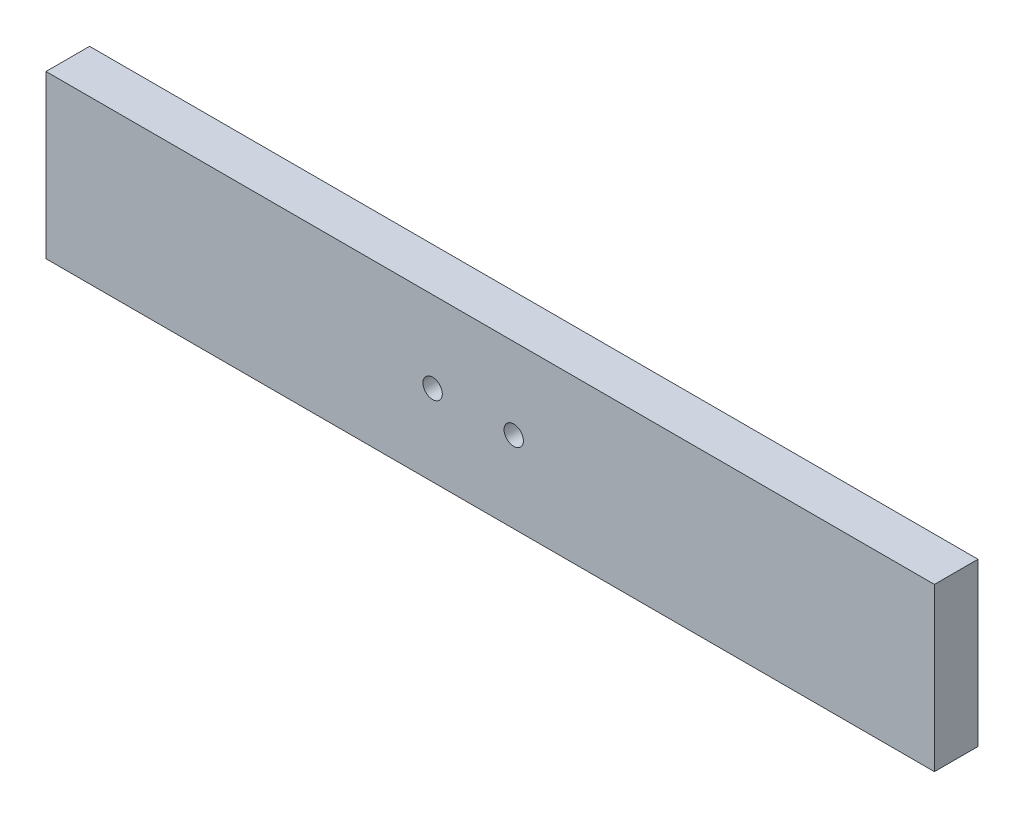
ISO-10303-21;
HEADER;
FILE_DESCRIPTION(('STEP AP214'),'2;1');
FILE_NAME('part.step','',(''),(''),'','','');
FILE_SCHEMA(('AUTOMOTIVE_DESIGN { 1 0 10303 214 1 1 1 1 }'));
ENDSEC;
DATA;
#1=APPLICATION_CONTEXT('core data for automotive mechanical design processes');
#2=APPLICATION_PROTOCOL_DEFINITION('international standard','automotive_design',2000,#1);
#3=PRODUCT_CONTEXT('',#1,'mechanical');
#4=PRODUCT('Part','Part','',(#3));
#5=PRODUCT_RELATED_PRODUCT_CATEGORY('part','',(#4));
#6=PRODUCT_DEFINITION_FORMATION('','',#4);
#7=PRODUCT_DEFINITION_CONTEXT('part definition',#1,'design');
#8=PRODUCT_DEFINITION('design','',#6,#7);
#9=PRODUCT_DEFINITION_SHAPE('','',#8);
#10=(LENGTH_UNIT() NAMED_UNIT(*) SI_UNIT(.MILLI.,.METRE.));
#11=(NAMED_UNIT(*) PLANE_ANGLE_UNIT() SI_UNIT($,.RADIAN.));
#12=(NAMED_UNIT(*) SI_UNIT($,.STERADIAN.) SOLID_ANGLE_UNIT());
#13=UNCERTAINTY_MEASURE_WITH_UNIT(LENGTH_MEASURE(1.E-05),#10,'distance_accuracy_value','');
#14=(GEOMETRIC_REPRESENTATION_CONTEXT(3) GLOBAL_UNCERTAINTY_ASSIGNED_CONTEXT((#13)) GLOBAL_UNIT_ASSIGNED_CONTEXT((#10,
#11,#12)) REPRESENTATION_CONTEXT('',''));
#15=CARTESIAN_POINT('',(0.,0.,0.));
#16=DIRECTION('',(0.,0.,1.));
#17=DIRECTION('',(1.,0.,0.));
#18=AXIS2_PLACEMENT_3D('',#15,#16,#17);
#19=CARTESIAN_POINT('',(0.,0.,18.));
#20=DIRECTION('',(0.,0.,1.));
#21=DIRECTION('',(1.,0.,0.));
#22=AXIS2_PLACEMENT_3D('',#19,#20,#21);
#23=PLANE('',#22);
#24=CARTESIAN_POINT('',(-174.551197831019,-31.3827880688748,18.));
#25=DIRECTION('',(0.,0.,1.));
#26=DIRECTION('',(1.,0.,0.));
#27=AXIS2_PLACEMENT_3D('',#24,#25,#26);
#28=CIRCLE('',#27,3.99999999999999);
#29=CARTESIAN_POINT('',(-170.551197831019,-31.3827880688748,18.));
#30=VERTEX_POINT('',#29);
#31=EDGE_CURVE('E100',#30,#30,#28,.T.);
#32=ORIENTED_EDGE('',*,*,#31,.F.);
#33=EDGE_LOOP('',(#32));
#34=FACE_BOUND('',#33,.T.);
#35=DIRECTION('',(0.,-1.,0.));
#36=VECTOR('',#35,1.);
#37=CARTESIAN_POINT('',(-334.261625266486,2.11721193112521,18.));
#38=LINE('',#37,#36);
#39=CARTESIAN_POINT('',(-334.261625266486,2.11721193112521,18.));
#40=VERTEX_POINT('',#39);
#41=CARTESIAN_POINT('',(-334.261625266486,-64.8827880688748,18.));
#42=VERTEX_POINT('',#41);
#43=EDGE_CURVE('E85',#40,#42,#38,.T.);
#44=ORIENTED_EDGE('',*,*,#43,.T.);
#45=DIRECTION('',(1.,0.,0.));
#46=VECTOR('',#45,1.);
#47=CARTESIAN_POINT('',(-334.261625266486,-64.8827880688748,18.));
#48=LINE('',#47,#46);
#49=CARTESIAN_POINT('',(32.7383747335144,-64.8827880688748,18.));
#50=VERTEX_POINT('',#49);
#51=EDGE_CURVE('E80',#42,#50,#48,.T.);
#52=ORIENTED_EDGE('',*,*,#51,.T.);
#53=DIRECTION('',(0.,1.,0.));
#54=VECTOR('',#53,1.);
#55=CARTESIAN_POINT('',(32.7383747335144,2.11721193112521,18.));
#56=LINE('',#55,#54);
#57=CARTESIAN_POINT('',(32.7383747335144,2.11721193112521,18.));
#58=VERTEX_POINT('',#57);
#59=EDGE_CURVE('E83',#50,#58,#56,.T.);
#60=ORIENTED_EDGE('',*,*,#59,.T.);
#61=DIRECTION('',(-1.,0.,0.));
#62=VECTOR('',#61,1.);
#63=CARTESIAN_POINT('',(-334.261625266486,2.11721193112521,18.));
#64=LINE('',#63,#62);
#65=EDGE_CURVE('E50',#58,#40,#64,.T.);
#66=ORIENTED_EDGE('',*,*,#65,.T.);
#67=EDGE_LOOP('',(#44,#52,#60,#66));
#68=FACE_BOUND('',#67,.T.);
#69=CARTESIAN_POINT('',(-141.051197831019,-31.3827880688748,18.));
#70=DIRECTION('',(0.,0.,1.));
#71=DIRECTION('',(1.,0.,0.));
#72=AXIS2_PLACEMENT_3D('',#69,#70,#71);
#73=CIRCLE('',#72,3.99999999999999);
#74=CARTESIAN_POINT('',(-137.051197831019,-31.3827880688748,18.));
#75=VERTEX_POINT('',#74);
#76=EDGE_CURVE('E115',#75,#75,#73,.T.);
#77=ORIENTED_EDGE('',*,*,#76,.F.);
#78=EDGE_LOOP('',(#77));
#79=FACE_BOUND('',#78,.T.);
#80=ADVANCED_FACE('F33',(#34,#68,#79),#23,.T.);
#81=CARTESIAN_POINT('',(0.,0.,0.));
#82=DIRECTION('',(0.,0.,1.));
#83=DIRECTION('',(1.,0.,0.));
#84=AXIS2_PLACEMENT_3D('',#81,#82,#83);
#85=PLANE('',#84);
#86=DIRECTION('',(0.,-1.,0.));
#87=VECTOR('',#86,1.);
#88=CARTESIAN_POINT('',(-334.261625266486,2.11721193112521,0.));
#89=LINE('',#88,#87);
#90=CARTESIAN_POINT('',(-334.261625266486,2.11721193112521,0.));
#91=VERTEX_POINT('',#90);
#92=CARTESIAN_POINT('',(-334.261625266486,-64.8827880688748,0.));
#93=VERTEX_POINT('',#92);
#94=EDGE_CURVE('E97',#91,#93,#89,.T.);
#95=ORIENTED_EDGE('',*,*,#94,.F.);
#96=DIRECTION('',(-1.,0.,0.));
#97=VECTOR('',#96,1.);
#98=CARTESIAN_POINT('',(-334.261625266486,2.11721193112521,0.));
#99=LINE('',#98,#97);
#100=CARTESIAN_POINT('',(32.7383747335144,2.11721193112521,0.));
#101=VERTEX_POINT('',#100);
#102=EDGE_CURVE('E73',#101,#91,#99,.T.);
#103=ORIENTED_EDGE('',*,*,#102,.F.);
#104=DIRECTION('',(0.,1.,0.));
#105=VECTOR('',#104,1.);
#106=CARTESIAN_POINT('',(32.7383747335144,2.11721193112521,0.));
#107=LINE('',#106,#105);
#108=CARTESIAN_POINT('',(32.7383747335144,-64.8827880688748,0.));
#109=VERTEX_POINT('',#108);
#110=EDGE_CURVE('E67',#109,#101,#107,.T.);
#111=ORIENTED_EDGE('',*,*,#110,.F.);
#112=DIRECTION('',(1.,0.,0.));
#113=VECTOR('',#112,1.);
#114=CARTESIAN_POINT('',(-334.261625266486,-64.8827880688748,0.));
#115=LINE('',#114,#113);
#116=EDGE_CURVE('E89',#93,#109,#115,.T.);
#117=ORIENTED_EDGE('',*,*,#116,.F.);
#118=EDGE_LOOP('',(#95,#103,#111,#117));
#119=FACE_BOUND('',#118,.T.);
#120=CARTESIAN_POINT('',(-174.551197831019,-31.3827880688748,0.));
#121=DIRECTION('',(0.,0.,1.));
#122=DIRECTION('',(1.,0.,0.));
#123=AXIS2_PLACEMENT_3D('',#120,#121,#122);
#124=CIRCLE('',#123,3.99999999999999);
#125=CARTESIAN_POINT('',(-170.551197831019,-31.3827880688748,0.));
#126=VERTEX_POINT('',#125);
#127=EDGE_CURVE('E112',#126,#126,#124,.T.);
#128=ORIENTED_EDGE('',*,*,#127,.T.);
#129=EDGE_LOOP('',(#128));
#130=FACE_BOUND('',#129,.T.);
#131=CARTESIAN_POINT('',(-141.051197831019,-31.3827880688748,0.));
#132=DIRECTION('',(0.,0.,1.));
#133=DIRECTION('',(1.,0.,0.));
#134=AXIS2_PLACEMENT_3D('',#131,#132,#133);
#135=CIRCLE('',#134,3.99999999999999);
#136=CARTESIAN_POINT('',(-137.051197831019,-31.3827880688748,0.));
#137=VERTEX_POINT('',#136);
#138=EDGE_CURVE('E118',#137,#137,#135,.T.);
#139=ORIENTED_EDGE('',*,*,#138,.T.);
#140=EDGE_LOOP('',(#139));
#141=FACE_BOUND('',#140,.T.);
#142=ADVANCED_FACE('F108',(#119,#130,#141),#85,.F.);
#143=CARTESIAN_POINT('',(-334.261625266486,2.11721193112521,18.));
#144=DIRECTION('',(1.,0.,0.));
#145=DIRECTION('',(0.,0.,-1.));
#146=AXIS2_PLACEMENT_3D('',#143,#144,#145);
#147=PLANE('',#146);
#148=ORIENTED_EDGE('',*,*,#94,.T.);
#149=DIRECTION('',(0.,0.,-1.));
#150=VECTOR('',#149,1.);
#151=CARTESIAN_POINT('',(-334.261625266486,-64.8827880688748,18.));
#152=LINE('',#151,#150);
#153=EDGE_CURVE('E11',#42,#93,#152,.T.);
#154=ORIENTED_EDGE('',*,*,#153,.F.);
#155=ORIENTED_EDGE('',*,*,#43,.F.);
#156=DIRECTION('',(0.,0.,-1.));
#157=VECTOR('',#156,1.);
#158=CARTESIAN_POINT('',(-334.261625266486,2.11721193112521,18.));
#159=LINE('',#158,#157);
#160=EDGE_CURVE('E93',#40,#91,#159,.T.);
#161=ORIENTED_EDGE('',*,*,#160,.T.);
#162=EDGE_LOOP('',(#148,#154,#155,#161));
#163=FACE_BOUND('',#162,.T.);
#164=ADVANCED_FACE('F35',(#163),#147,.F.);
#165=CARTESIAN_POINT('',(-334.261625266486,-64.8827880688748,18.));
#166=DIRECTION('',(0.,1.,0.));
#167=DIRECTION('',(0.,0.,1.));
#168=AXIS2_PLACEMENT_3D('',#165,#166,#167);
#169=PLANE('',#168);
#170=ORIENTED_EDGE('',*,*,#116,.T.);
#171=DIRECTION('',(0.,0.,-1.));
#172=VECTOR('',#171,1.);
#173=CARTESIAN_POINT('',(32.7383747335144,-64.8827880688748,18.));
#174=LINE('',#173,#172);
#175=EDGE_CURVE('E42',#50,#109,#174,.T.);
#176=ORIENTED_EDGE('',*,*,#175,.F.);
#177=ORIENTED_EDGE('',*,*,#51,.F.);
#178=ORIENTED_EDGE('',*,*,#153,.T.);
#179=EDGE_LOOP('',(#170,#176,#177,#178));
#180=FACE_BOUND('',#179,.T.);
#181=ADVANCED_FACE('F88',(#180),#169,.F.);
#182=CARTESIAN_POINT('',(32.7383747335144,2.11721193112521,18.));
#183=DIRECTION('',(-1.,0.,0.));
#184=DIRECTION('',(0.,-1.,0.));
#185=AXIS2_PLACEMENT_3D('',#182,#183,#184);
#186=PLANE('',#185);
#187=ORIENTED_EDGE('',*,*,#110,.T.);
#188=DIRECTION('',(0.,0.,-1.));
#189=VECTOR('',#188,1.);
#190=CARTESIAN_POINT('',(32.7383747335144,2.11721193112521,18.));
#191=LINE('',#190,#189);
#192=EDGE_CURVE('E90',#58,#101,#191,.T.);
#193=ORIENTED_EDGE('',*,*,#192,.F.);
#194=ORIENTED_EDGE('',*,*,#59,.F.);
#195=ORIENTED_EDGE('',*,*,#175,.T.);
#196=EDGE_LOOP('',(#187,#193,#194,#195));
#197=FACE_BOUND('',#196,.T.);
#198=ADVANCED_FACE('F91',(#197),#186,.F.);
#199=CARTESIAN_POINT('',(-334.261625266486,2.11721193112521,18.));
#200=DIRECTION('',(0.,-1.,0.));
#201=DIRECTION('',(0.,0.,-1.));
#202=AXIS2_PLACEMENT_3D('',#199,#200,#201);
#203=PLANE('',#202);
#204=ORIENTED_EDGE('',*,*,#102,.T.);
#205=ORIENTED_EDGE('',*,*,#160,.F.);
#206=ORIENTED_EDGE('',*,*,#65,.F.);
#207=ORIENTED_EDGE('',*,*,#192,.T.);
#208=EDGE_LOOP('',(#204,#205,#206,#207));
#209=FACE_BOUND('',#208,.T.);
#210=ADVANCED_FACE('F105',(#209),#203,.F.);
#211=CARTESIAN_POINT('',(-174.551197831019,-31.3827880688748,18.));
#212=DIRECTION('',(0.,0.,-1.));
#213=DIRECTION('',(-1.,0.,0.));
#214=AXIS2_PLACEMENT_3D('',#211,#212,#213);
#215=CYLINDRICAL_SURFACE('',#214,3.99999999999999);
#216=ORIENTED_EDGE('',*,*,#31,.T.);
#217=EDGE_LOOP('',(#216));
#218=FACE_BOUND('',#217,.T.);
#219=ORIENTED_EDGE('',*,*,#127,.F.);
#220=EDGE_LOOP('',(#219));
#221=FACE_BOUND('',#220,.T.);
#222=ADVANCED_FACE('F135',(#218,#221),#215,.F.);
#223=CARTESIAN_POINT('',(-141.051197831019,-31.3827880688748,18.));
#224=DIRECTION('',(0.,0.,-1.));
#225=DIRECTION('',(-1.,0.,0.));
#226=AXIS2_PLACEMENT_3D('',#223,#224,#225);
#227=CYLINDRICAL_SURFACE('',#226,3.99999999999999);
#228=ORIENTED_EDGE('',*,*,#76,.T.);
#229=EDGE_LOOP('',(#228));
#230=FACE_BOUND('',#229,.T.);
#231=ORIENTED_EDGE('',*,*,#138,.F.);
#232=EDGE_LOOP('',(#231));
#233=FACE_BOUND('',#232,.T.);
#234=ADVANCED_FACE('F124',(#230,#233),#227,.F.);
#235=CLOSED_SHELL('',(#80,#142,#164,#181,#198,#210,#222,#234));
#236=MANIFOLD_SOLID_BREP('B2',#235);
#237=ADVANCED_BREP_SHAPE_REPRESENTATION('',(#18,#236),#14);
#238=SHAPE_DEFINITION_REPRESENTATION(#9,#237);
ENDSEC;
END-ISO-10303-21;
